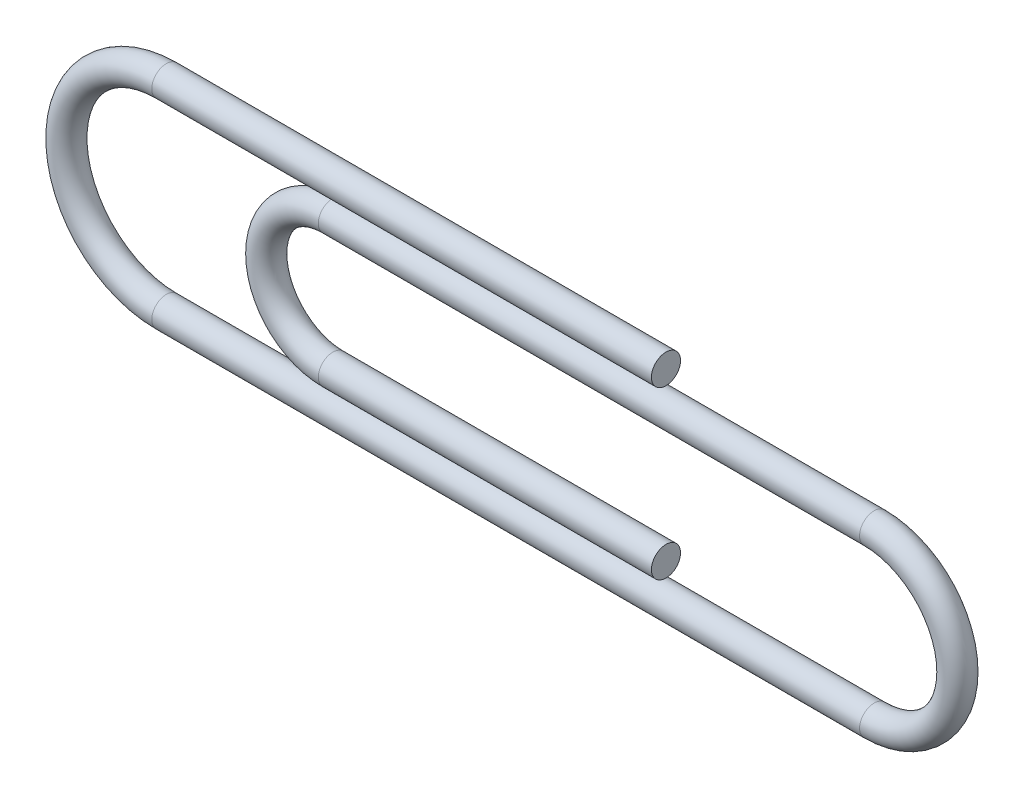
ISO-10303-21;
HEADER;
FILE_DESCRIPTION(('STEP AP214'),'2;1');
FILE_NAME('part.step','',(''),(''),'','','');
FILE_SCHEMA(('AUTOMOTIVE_DESIGN { 1 0 10303 214 1 1 1 1 }'));
ENDSEC;
DATA;
#1=APPLICATION_CONTEXT('core data for automotive mechanical design processes');
#2=APPLICATION_PROTOCOL_DEFINITION('international standard','automotive_design',2000,#1);
#3=PRODUCT_CONTEXT('',#1,'mechanical');
#4=PRODUCT('Part','Part','',(#3));
#5=PRODUCT_RELATED_PRODUCT_CATEGORY('part','',(#4));
#6=PRODUCT_DEFINITION_FORMATION('','',#4);
#7=PRODUCT_DEFINITION_CONTEXT('part definition',#1,'design');
#8=PRODUCT_DEFINITION('design','',#6,#7);
#9=PRODUCT_DEFINITION_SHAPE('','',#8);
#10=(LENGTH_UNIT() NAMED_UNIT(*) SI_UNIT(.MILLI.,.METRE.));
#11=(NAMED_UNIT(*) PLANE_ANGLE_UNIT() SI_UNIT($,.RADIAN.));
#12=(NAMED_UNIT(*) SI_UNIT($,.STERADIAN.) SOLID_ANGLE_UNIT());
#13=UNCERTAINTY_MEASURE_WITH_UNIT(LENGTH_MEASURE(1.E-05),#10,'distance_accuracy_value','');
#14=(GEOMETRIC_REPRESENTATION_CONTEXT(3) GLOBAL_UNCERTAINTY_ASSIGNED_CONTEXT((#13)) GLOBAL_UNIT_ASSIGNED_CONTEXT((#10,
#11,#12)) REPRESENTATION_CONTEXT('',''));
#15=CARTESIAN_POINT('',(0.,0.,0.));
#16=DIRECTION('',(0.,0.,1.));
#17=DIRECTION('',(1.,0.,0.));
#18=AXIS2_PLACEMENT_3D('',#15,#16,#17);
#19=CARTESIAN_POINT('',(0.,0.,0.));
#20=DIRECTION('',(1.,0.,0.));
#21=DIRECTION('',(0.,0.,-1.));
#22=AXIS2_PLACEMENT_3D('',#19,#20,#21);
#23=PLANE('',#22);
#24=CARTESIAN_POINT('',(0.,0.,0.));
#25=DIRECTION('',(1.,0.,0.));
#26=DIRECTION('',(0.,0.,-1.));
#27=AXIS2_PLACEMENT_3D('',#24,#25,#26);
#28=CIRCLE('',#27,2.2225);
#29=CARTESIAN_POINT('',(0.,0.,-2.2225));
#30=VERTEX_POINT('',#29);
#31=EDGE_CURVE('E69',#30,#30,#28,.T.);
#32=ORIENTED_EDGE('',*,*,#31,.T.);
#33=EDGE_LOOP('',(#32));
#34=FACE_BOUND('',#33,.T.);
#35=ADVANCED_FACE('F41',(#34),#23,.T.);
#36=CARTESIAN_POINT('',(0.,25.4,0.));
#37=DIRECTION('',(-1.,0.,0.));
#38=DIRECTION('',(0.,0.,-1.));
#39=AXIS2_PLACEMENT_3D('',#36,#37,#38);
#40=PLANE('',#39);
#41=CARTESIAN_POINT('',(0.,25.4,0.));
#42=DIRECTION('',(-1.,0.,0.));
#43=DIRECTION('',(0.,0.,-1.));
#44=AXIS2_PLACEMENT_3D('',#41,#42,#43);
#45=CIRCLE('',#44,2.2225);
#46=CARTESIAN_POINT('',(0.,25.4,-2.2225));
#47=VERTEX_POINT('',#46);
#48=EDGE_CURVE('E10',#47,#47,#45,.T.);
#49=ORIENTED_EDGE('',*,*,#48,.F.);
#50=EDGE_LOOP('',(#49));
#51=FACE_BOUND('',#50,.T.);
#52=ADVANCED_FACE('F77',(#51),#40,.F.);
#53=CARTESIAN_POINT('',(0.,0.,0.));
#54=DIRECTION('',(-1.,0.,0.));
#55=DIRECTION('',(0.,0.,1.));
#56=AXIS2_PLACEMENT_3D('',#53,#54,#55);
#57=CYLINDRICAL_SURFACE('',#56,2.2225);
#58=CARTESIAN_POINT('',(-50.8,0.,0.));
#59=DIRECTION('',(1.,0.,0.));
#60=DIRECTION('',(0.,0.,-1.));
#61=AXIS2_PLACEMENT_3D('',#58,#59,#60);
#62=CIRCLE('',#61,2.2225);
#63=CARTESIAN_POINT('',(-50.8,-2.2225,0.));
#64=VERTEX_POINT('',#63);
#65=EDGE_CURVE('E66',#64,#64,#62,.T.);
#66=ORIENTED_EDGE('',*,*,#65,.T.);
#67=EDGE_LOOP('',(#66));
#68=FACE_BOUND('',#67,.T.);
#69=ORIENTED_EDGE('',*,*,#31,.F.);
#70=EDGE_LOOP('',(#69));
#71=FACE_BOUND('',#70,.T.);
#72=ADVANCED_FACE('F74',(#68,#71),#57,.T.);
#73=CARTESIAN_POINT('',(-50.8,10.16,0.));
#74=DIRECTION('',(0.,0.,-1.));
#75=DIRECTION('',(-1.,0.,0.));
#76=AXIS2_PLACEMENT_3D('',#73,#74,#75);
#77=TOROIDAL_SURFACE('',#76,10.16,2.2225);
#78=CARTESIAN_POINT('',(-50.8,20.32,0.));
#79=DIRECTION('',(-1.,0.,0.));
#80=DIRECTION('',(0.,0.,-1.));
#81=AXIS2_PLACEMENT_3D('',#78,#79,#80);
#82=CIRCLE('',#81,2.2225);
#83=CARTESIAN_POINT('',(-50.8,22.5425,0.));
#84=VERTEX_POINT('',#83);
#85=EDGE_CURVE('E63',#84,#84,#82,.T.);
#86=CARTESIAN_POINT('',(-50.8,10.16,0.));
#87=DIRECTION('',(0.,0.,-1.));
#88=DIRECTION('',(-1.,0.,0.));
#89=AXIS2_PLACEMENT_3D('',#86,#87,#88);
#90=CIRCLE('',#89,12.3825);
#91=EDGE_CURVE('',#64,#84,#90,.T.);
#92=ORIENTED_EDGE('',*,*,#65,.F.);
#93=ORIENTED_EDGE('',*,*,#85,.T.);
#94=ORIENTED_EDGE('',*,*,#91,.T.);
#95=ORIENTED_EDGE('',*,*,#91,.F.);
#96=EDGE_LOOP('',(#92,#94,#93,#95));
#97=FACE_BOUND('',#96,.T.);
#98=ADVANCED_FACE('F76',(#97),#77,.T.);
#99=CARTESIAN_POINT('',(-50.8,20.32,0.));
#100=DIRECTION('',(1.,0.,0.));
#101=DIRECTION('',(0.,0.,-1.));
#102=AXIS2_PLACEMENT_3D('',#99,#100,#101);
#103=CYLINDRICAL_SURFACE('',#102,2.2225);
#104=CARTESIAN_POINT('',(31.75,20.32,0.));
#105=DIRECTION('',(-1.,0.,0.));
#106=DIRECTION('',(0.,0.,-1.));
#107=AXIS2_PLACEMENT_3D('',#104,#105,#106);
#108=CIRCLE('',#107,2.2225);
#109=CARTESIAN_POINT('',(31.75,22.5425,0.));
#110=VERTEX_POINT('',#109);
#111=EDGE_CURVE('E60',#110,#110,#108,.T.);
#112=ORIENTED_EDGE('',*,*,#111,.T.);
#113=EDGE_LOOP('',(#112));
#114=FACE_BOUND('',#113,.T.);
#115=ORIENTED_EDGE('',*,*,#85,.F.);
#116=EDGE_LOOP('',(#115));
#117=FACE_BOUND('',#116,.T.);
#118=ADVANCED_FACE('F84',(#114,#117),#103,.T.);
#119=CARTESIAN_POINT('',(31.75,7.61999999999999,0.));
#120=DIRECTION('',(0.,0.,-1.));
#121=DIRECTION('',(-1.,0.,0.));
#122=AXIS2_PLACEMENT_3D('',#119,#120,#121);
#123=TOROIDAL_SURFACE('',#122,12.7,2.2225);
#124=CARTESIAN_POINT('',(31.75,-5.08000000000001,0.));
#125=DIRECTION('',(1.,0.,0.));
#126=DIRECTION('',(0.,0.,-1.));
#127=AXIS2_PLACEMENT_3D('',#124,#125,#126);
#128=CIRCLE('',#127,2.2225);
#129=CARTESIAN_POINT('',(31.75,-7.30250000000001,0.));
#130=VERTEX_POINT('',#129);
#131=EDGE_CURVE('E55',#130,#130,#128,.T.);
#132=CARTESIAN_POINT('',(31.75,7.61999999999999,0.));
#133=DIRECTION('',(0.,0.,-1.));
#134=DIRECTION('',(-1.,0.,0.));
#135=AXIS2_PLACEMENT_3D('',#132,#133,#134);
#136=CIRCLE('',#135,14.9225);
#137=EDGE_CURVE('',#110,#130,#136,.T.);
#138=ORIENTED_EDGE('',*,*,#111,.F.);
#139=ORIENTED_EDGE('',*,*,#131,.T.);
#140=ORIENTED_EDGE('',*,*,#137,.T.);
#141=ORIENTED_EDGE('',*,*,#137,.F.);
#142=EDGE_LOOP('',(#138,#140,#139,#141));
#143=FACE_BOUND('',#142,.T.);
#144=ADVANCED_FACE('F101',(#143),#123,.T.);
#145=CARTESIAN_POINT('',(31.75,-5.08,0.));
#146=DIRECTION('',(-1.,0.,0.));
#147=DIRECTION('',(0.,-1.,0.));
#148=AXIS2_PLACEMENT_3D('',#145,#146,#147);
#149=CYLINDRICAL_SURFACE('',#148,2.2225);
#150=CARTESIAN_POINT('',(-76.2,-5.08000000000002,0.));
#151=DIRECTION('',(1.,0.,0.));
#152=DIRECTION('',(0.,0.,-1.));
#153=AXIS2_PLACEMENT_3D('',#150,#151,#152);
#154=CIRCLE('',#153,2.2225);
#155=CARTESIAN_POINT('',(-76.2,-7.30250000000001,0.));
#156=VERTEX_POINT('',#155);
#157=EDGE_CURVE('E51',#156,#156,#154,.T.);
#158=ORIENTED_EDGE('',*,*,#157,.T.);
#159=EDGE_LOOP('',(#158));
#160=FACE_BOUND('',#159,.T.);
#161=ORIENTED_EDGE('',*,*,#131,.F.);
#162=EDGE_LOOP('',(#161));
#163=FACE_BOUND('',#162,.T.);
#164=ADVANCED_FACE('F95',(#160,#163),#149,.T.);
#165=CARTESIAN_POINT('',(-76.2,10.16,0.));
#166=DIRECTION('',(0.,0.,-1.));
#167=DIRECTION('',(-1.,0.,0.));
#168=AXIS2_PLACEMENT_3D('',#165,#166,#167);
#169=TOROIDAL_SURFACE('',#168,15.24,2.2225);
#170=CARTESIAN_POINT('',(-76.2,25.4,0.));
#171=DIRECTION('',(-1.,0.,0.));
#172=DIRECTION('',(0.,0.,-1.));
#173=AXIS2_PLACEMENT_3D('',#170,#171,#172);
#174=CIRCLE('',#173,2.2225);
#175=CARTESIAN_POINT('',(-76.2,27.6225,0.));
#176=VERTEX_POINT('',#175);
#177=EDGE_CURVE('E47',#176,#176,#174,.T.);
#178=CARTESIAN_POINT('',(-76.2,10.16,0.));
#179=DIRECTION('',(0.,0.,-1.));
#180=DIRECTION('',(-1.,0.,0.));
#181=AXIS2_PLACEMENT_3D('',#178,#179,#180);
#182=CIRCLE('',#181,17.4625);
#183=EDGE_CURVE('',#156,#176,#182,.T.);
#184=ORIENTED_EDGE('',*,*,#157,.F.);
#185=ORIENTED_EDGE('',*,*,#177,.T.);
#186=ORIENTED_EDGE('',*,*,#183,.T.);
#187=ORIENTED_EDGE('',*,*,#183,.F.);
#188=EDGE_LOOP('',(#184,#186,#185,#187));
#189=FACE_BOUND('',#188,.T.);
#190=ADVANCED_FACE('F90',(#189),#169,.T.);
#191=CARTESIAN_POINT('',(-76.2,25.4,0.));
#192=DIRECTION('',(1.,0.,0.));
#193=DIRECTION('',(0.,1.,0.));
#194=AXIS2_PLACEMENT_3D('',#191,#192,#193);
#195=CYLINDRICAL_SURFACE('',#194,2.2225);
#196=ORIENTED_EDGE('',*,*,#48,.T.);
#197=EDGE_LOOP('',(#196));
#198=FACE_BOUND('',#197,.T.);
#199=ORIENTED_EDGE('',*,*,#177,.F.);
#200=EDGE_LOOP('',(#199));
#201=FACE_BOUND('',#200,.T.);
#202=ADVANCED_FACE('F88',(#198,#201),#195,.T.);
#203=CLOSED_SHELL('',(#35,#52,#72,#98,#118,#144,#164,#190,#202));
#204=MANIFOLD_SOLID_BREP('B2',#203);
#205=ADVANCED_BREP_SHAPE_REPRESENTATION('',(#18,#204),#14);
#206=SHAPE_DEFINITION_REPRESENTATION(#9,#205);
ENDSEC;
END-ISO-10303-21;
